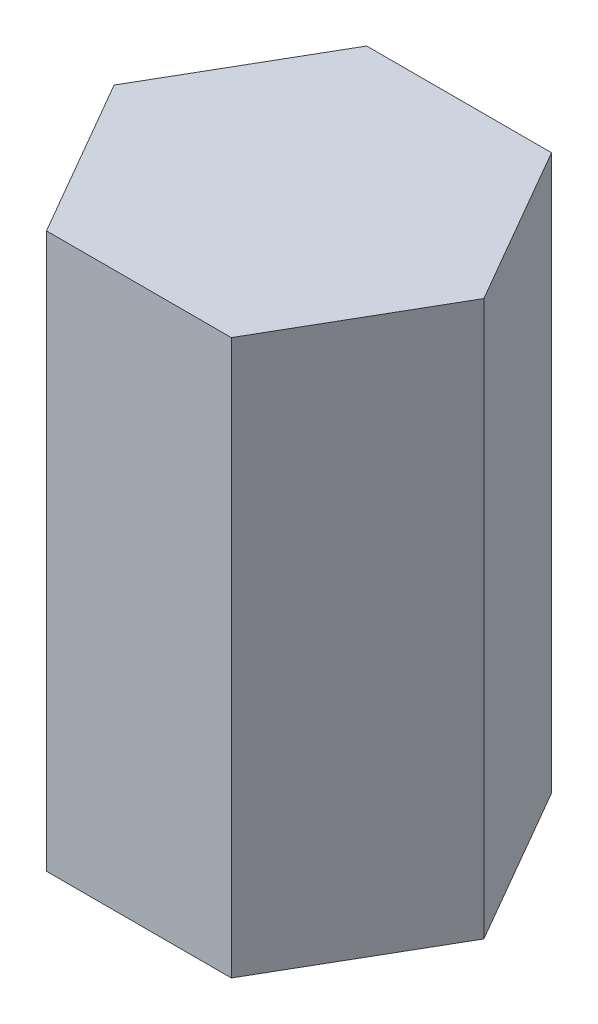
ISO-10303-21;
HEADER;
FILE_DESCRIPTION(('STEP AP214'),'2;1');
FILE_NAME('part.step','',(''),(''),'','','');
FILE_SCHEMA(('AUTOMOTIVE_DESIGN { 1 0 10303 214 1 1 1 1 }'));
ENDSEC;
DATA;
#1=APPLICATION_CONTEXT('core data for automotive mechanical design processes');
#2=APPLICATION_PROTOCOL_DEFINITION('international standard','automotive_design',2000,#1);
#3=PRODUCT_CONTEXT('',#1,'mechanical');
#4=PRODUCT('Part','Part','',(#3));
#5=PRODUCT_RELATED_PRODUCT_CATEGORY('part','',(#4));
#6=PRODUCT_DEFINITION_FORMATION('','',#4);
#7=PRODUCT_DEFINITION_CONTEXT('part definition',#1,'design');
#8=PRODUCT_DEFINITION('design','',#6,#7);
#9=PRODUCT_DEFINITION_SHAPE('','',#8);
#10=(LENGTH_UNIT() NAMED_UNIT(*) SI_UNIT(.MILLI.,.METRE.));
#11=(NAMED_UNIT(*) PLANE_ANGLE_UNIT() SI_UNIT($,.RADIAN.));
#12=(NAMED_UNIT(*) SI_UNIT($,.STERADIAN.) SOLID_ANGLE_UNIT());
#13=UNCERTAINTY_MEASURE_WITH_UNIT(LENGTH_MEASURE(1.E-05),#10,'distance_accuracy_value','');
#14=(GEOMETRIC_REPRESENTATION_CONTEXT(3) GLOBAL_UNCERTAINTY_ASSIGNED_CONTEXT((#13)) GLOBAL_UNIT_ASSIGNED_CONTEXT((#10,
#11,#12)) REPRESENTATION_CONTEXT('',''));
#15=CARTESIAN_POINT('',(0.,0.,0.));
#16=DIRECTION('',(0.,0.,1.));
#17=DIRECTION('',(1.,0.,0.));
#18=AXIS2_PLACEMENT_3D('',#15,#16,#17);
#19=CARTESIAN_POINT('',(20.0000000000004,120.,34.6410161513773));
#20=DIRECTION('',(-0.866025403784441,0.,-0.499999999999995));
#21=DIRECTION('',(-0.499999999999995,0.,0.866025403784441));
#22=AXIS2_PLACEMENT_3D('',#19,#20,#21);
#23=PLANE('',#22);
#24=DIRECTION('',(0.499999999999995,0.,-0.866025403784441));
#25=VECTOR('',#24,1.);
#26=CARTESIAN_POINT('',(20.0000000000004,0.,34.6410161513773));
#27=LINE('',#26,#25);
#28=CARTESIAN_POINT('',(20.0000000000004,0.,34.6410161513773));
#29=VERTEX_POINT('',#28);
#30=CARTESIAN_POINT('',(40.,0.,0.));
#31=VERTEX_POINT('',#30);
#32=EDGE_CURVE('E123',#29,#31,#27,.T.);
#33=ORIENTED_EDGE('',*,*,#32,.T.);
#34=DIRECTION('',(0.,-1.,0.));
#35=VECTOR('',#34,1.);
#36=CARTESIAN_POINT('',(40.,120.,0.));
#37=LINE('',#36,#35);
#38=CARTESIAN_POINT('',(40.,120.,0.));
#39=VERTEX_POINT('',#38);
#40=EDGE_CURVE('E11',#39,#31,#37,.T.);
#41=ORIENTED_EDGE('',*,*,#40,.F.);
#42=DIRECTION('',(0.499999999999995,0.,-0.866025403784441));
#43=VECTOR('',#42,1.);
#44=CARTESIAN_POINT('',(20.0000000000004,120.,34.6410161513773));
#45=LINE('',#44,#43);
#46=CARTESIAN_POINT('',(20.0000000000004,120.,34.6410161513773));
#47=VERTEX_POINT('',#46);
#48=EDGE_CURVE('E134',#47,#39,#45,.T.);
#49=ORIENTED_EDGE('',*,*,#48,.F.);
#50=DIRECTION('',(0.,-1.,0.));
#51=VECTOR('',#50,1.);
#52=CARTESIAN_POINT('',(20.0000000000004,120.,34.6410161513773));
#53=LINE('',#52,#51);
#54=EDGE_CURVE('E119',#47,#29,#53,.T.);
#55=ORIENTED_EDGE('',*,*,#54,.T.);
#56=EDGE_LOOP('',(#33,#41,#49,#55));
#57=FACE_BOUND('',#56,.T.);
#58=ADVANCED_FACE('F39',(#57),#23,.F.);
#59=CARTESIAN_POINT('',(40.,120.,0.));
#60=DIRECTION('',(-0.866025403784438,0.,0.500000000000001));
#61=DIRECTION('',(0.500000000000001,0.,0.866025403784438));
#62=AXIS2_PLACEMENT_3D('',#59,#60,#61);
#63=PLANE('',#62);
#64=DIRECTION('',(-0.500000000000001,0.,-0.866025403784438));
#65=VECTOR('',#64,1.);
#66=CARTESIAN_POINT('',(40.,0.,0.));
#67=LINE('',#66,#65);
#68=CARTESIAN_POINT('',(19.9999999999999,0.,-34.6410161513776));
#69=VERTEX_POINT('',#68);
#70=EDGE_CURVE('E126',#31,#69,#67,.T.);
#71=ORIENTED_EDGE('',*,*,#70,.T.);
#72=DIRECTION('',(0.,-1.,0.));
#73=VECTOR('',#72,1.);
#74=CARTESIAN_POINT('',(19.9999999999999,120.,-34.6410161513776));
#75=LINE('',#74,#73);
#76=CARTESIAN_POINT('',(19.9999999999999,120.,-34.6410161513776));
#77=VERTEX_POINT('',#76);
#78=EDGE_CURVE('E47',#77,#69,#75,.T.);
#79=ORIENTED_EDGE('',*,*,#78,.F.);
#80=DIRECTION('',(-0.500000000000001,0.,-0.866025403784438));
#81=VECTOR('',#80,1.);
#82=CARTESIAN_POINT('',(40.,120.,0.));
#83=LINE('',#82,#81);
#84=EDGE_CURVE('E92',#39,#77,#83,.T.);
#85=ORIENTED_EDGE('',*,*,#84,.F.);
#86=ORIENTED_EDGE('',*,*,#40,.T.);
#87=EDGE_LOOP('',(#71,#79,#85,#86));
#88=FACE_BOUND('',#87,.T.);
#89=ADVANCED_FACE('F158',(#88),#63,.F.);
#90=CARTESIAN_POINT('',(19.9999999999999,120.,-34.6410161513776));
#91=DIRECTION('',(0.,0.,1.));
#92=DIRECTION('',(1.,0.,0.));
#93=AXIS2_PLACEMENT_3D('',#90,#91,#92);
#94=PLANE('',#93);
#95=DIRECTION('',(-1.,0.,0.));
#96=VECTOR('',#95,1.);
#97=CARTESIAN_POINT('',(19.9999999999999,0.,-34.6410161513776));
#98=LINE('',#97,#96);
#99=CARTESIAN_POINT('',(-20.0000000000002,0.,-34.6410161513775));
#100=VERTEX_POINT('',#99);
#101=EDGE_CURVE('E129',#69,#100,#98,.T.);
#102=ORIENTED_EDGE('',*,*,#101,.T.);
#103=DIRECTION('',(0.,-1.,0.));
#104=VECTOR('',#103,1.);
#105=CARTESIAN_POINT('',(-20.0000000000002,120.,-34.6410161513775));
#106=LINE('',#105,#104);
#107=CARTESIAN_POINT('',(-20.0000000000002,120.,-34.6410161513775));
#108=VERTEX_POINT('',#107);
#109=EDGE_CURVE('E114',#108,#100,#106,.T.);
#110=ORIENTED_EDGE('',*,*,#109,.F.);
#111=DIRECTION('',(-1.,0.,0.));
#112=VECTOR('',#111,1.);
#113=CARTESIAN_POINT('',(19.9999999999999,120.,-34.6410161513776));
#114=LINE('',#113,#112);
#115=EDGE_CURVE('E105',#77,#108,#114,.T.);
#116=ORIENTED_EDGE('',*,*,#115,.F.);
#117=ORIENTED_EDGE('',*,*,#78,.T.);
#118=EDGE_LOOP('',(#102,#110,#116,#117));
#119=FACE_BOUND('',#118,.T.);
#120=ADVANCED_FACE('F140',(#119),#94,.F.);
#121=CARTESIAN_POINT('',(-20.0000000000002,120.,-34.6410161513775));
#122=DIRECTION('',(0.866025403784442,0.,0.499999999999995));
#123=DIRECTION('',(0.499999999999995,0.,-0.866025403784442));
#124=AXIS2_PLACEMENT_3D('',#121,#122,#123);
#125=PLANE('',#124);
#126=DIRECTION('',(-0.499999999999995,0.,0.866025403784442));
#127=VECTOR('',#126,1.);
#128=CARTESIAN_POINT('',(-20.0000000000002,0.,-34.6410161513775));
#129=LINE('',#128,#127);
#130=CARTESIAN_POINT('',(-40.,0.,2.79318507107451E-13));
#131=VERTEX_POINT('',#130);
#132=EDGE_CURVE('E113',#100,#131,#129,.T.);
#133=ORIENTED_EDGE('',*,*,#132,.T.);
#134=DIRECTION('',(0.,-1.,0.));
#135=VECTOR('',#134,1.);
#136=CARTESIAN_POINT('',(-40.,120.,2.79318507107451E-13));
#137=LINE('',#136,#135);
#138=CARTESIAN_POINT('',(-40.,120.,2.79318507107451E-13));
#139=VERTEX_POINT('',#138);
#140=EDGE_CURVE('E110',#139,#131,#137,.T.);
#141=ORIENTED_EDGE('',*,*,#140,.F.);
#142=DIRECTION('',(-0.499999999999995,0.,0.866025403784442));
#143=VECTOR('',#142,1.);
#144=CARTESIAN_POINT('',(-20.0000000000002,120.,-34.6410161513775));
#145=LINE('',#144,#143);
#146=EDGE_CURVE('E99',#108,#139,#145,.T.);
#147=ORIENTED_EDGE('',*,*,#146,.F.);
#148=ORIENTED_EDGE('',*,*,#109,.T.);
#149=EDGE_LOOP('',(#133,#141,#147,#148));
#150=FACE_BOUND('',#149,.T.);
#151=ADVANCED_FACE('F111',(#150),#125,.F.);
#152=CARTESIAN_POINT('',(-40.,120.,2.79318507107451E-13));
#153=DIRECTION('',(0.866025403784435,0.,-0.500000000000007));
#154=DIRECTION('',(-0.500000000000007,0.,-0.866025403784435));
#155=AXIS2_PLACEMENT_3D('',#152,#153,#154);
#156=PLANE('',#155);
#157=DIRECTION('',(0.500000000000007,0.,0.866025403784434));
#158=VECTOR('',#157,1.);
#159=CARTESIAN_POINT('',(-40.,0.,2.79318507107451E-13));
#160=LINE('',#159,#158);
#161=CARTESIAN_POINT('',(-19.9999999999997,0.,34.6410161513777));
#162=VERTEX_POINT('',#161);
#163=EDGE_CURVE('E78',#131,#162,#160,.T.);
#164=ORIENTED_EDGE('',*,*,#163,.T.);
#165=DIRECTION('',(0.,-1.,0.));
#166=VECTOR('',#165,1.);
#167=CARTESIAN_POINT('',(-19.9999999999997,120.,34.6410161513777));
#168=LINE('',#167,#166);
#169=CARTESIAN_POINT('',(-19.9999999999997,120.,34.6410161513777));
#170=VERTEX_POINT('',#169);
#171=EDGE_CURVE('E115',#170,#162,#168,.T.);
#172=ORIENTED_EDGE('',*,*,#171,.F.);
#173=DIRECTION('',(0.500000000000007,0.,0.866025403784434));
#174=VECTOR('',#173,1.);
#175=CARTESIAN_POINT('',(-40.,120.,2.79318507107451E-13));
#176=LINE('',#175,#174);
#177=EDGE_CURVE('E103',#139,#170,#176,.T.);
#178=ORIENTED_EDGE('',*,*,#177,.F.);
#179=ORIENTED_EDGE('',*,*,#140,.T.);
#180=EDGE_LOOP('',(#164,#172,#178,#179));
#181=FACE_BOUND('',#180,.T.);
#182=ADVANCED_FACE('F117',(#181),#156,.F.);
#183=CARTESIAN_POINT('',(-19.9999999999997,120.,34.6410161513777));
#184=DIRECTION('',(0.,0.,-1.));
#185=DIRECTION('',(-1.,0.,0.));
#186=AXIS2_PLACEMENT_3D('',#183,#184,#185);
#187=PLANE('',#186);
#188=DIRECTION('',(1.,0.,0.));
#189=VECTOR('',#188,1.);
#190=CARTESIAN_POINT('',(-19.9999999999997,0.,34.6410161513777));
#191=LINE('',#190,#189);
#192=EDGE_CURVE('E84',#162,#29,#191,.T.);
#193=ORIENTED_EDGE('',*,*,#192,.T.);
#194=ORIENTED_EDGE('',*,*,#54,.F.);
#195=DIRECTION('',(1.,0.,0.));
#196=VECTOR('',#195,1.);
#197=CARTESIAN_POINT('',(-19.9999999999997,120.,34.6410161513777));
#198=LINE('',#197,#196);
#199=EDGE_CURVE('E55',#170,#47,#198,.T.);
#200=ORIENTED_EDGE('',*,*,#199,.F.);
#201=ORIENTED_EDGE('',*,*,#171,.T.);
#202=EDGE_LOOP('',(#193,#194,#200,#201));
#203=FACE_BOUND('',#202,.T.);
#204=ADVANCED_FACE('F147',(#203),#187,.F.);
#205=CARTESIAN_POINT('',(0.,120.,0.));
#206=DIRECTION('',(0.,1.,0.));
#207=DIRECTION('',(0.,0.,1.));
#208=AXIS2_PLACEMENT_3D('',#205,#206,#207);
#209=PLANE('',#208);
#210=ORIENTED_EDGE('',*,*,#48,.T.);
#211=ORIENTED_EDGE('',*,*,#84,.T.);
#212=ORIENTED_EDGE('',*,*,#115,.T.);
#213=ORIENTED_EDGE('',*,*,#146,.T.);
#214=ORIENTED_EDGE('',*,*,#177,.T.);
#215=ORIENTED_EDGE('',*,*,#199,.T.);
#216=EDGE_LOOP('',(#210,#211,#212,#213,#214,#215));
#217=FACE_BOUND('',#216,.T.);
#218=ADVANCED_FACE('F101',(#217),#209,.T.);
#219=CARTESIAN_POINT('',(0.,0.,0.));
#220=DIRECTION('',(0.,1.,0.));
#221=DIRECTION('',(0.,0.,1.));
#222=AXIS2_PLACEMENT_3D('',#219,#220,#221);
#223=PLANE('',#222);
#224=CARTESIAN_POINT('',(0.,0.,0.));
#225=DIRECTION('',(0.,1.,0.));
#226=DIRECTION('',(0.,0.,1.));
#227=AXIS2_PLACEMENT_3D('',#224,#225,#226);
#228=CIRCLE('',#227,4.);
#229=CARTESIAN_POINT('',(0.,0.,4.));
#230=VERTEX_POINT('',#229);
#231=EDGE_CURVE('E221',#230,#230,#228,.T.);
#232=ORIENTED_EDGE('',*,*,#231,.T.);
#233=EDGE_LOOP('',(#232));
#234=FACE_BOUND('',#233,.T.);
#235=ORIENTED_EDGE('',*,*,#32,.F.);
#236=ORIENTED_EDGE('',*,*,#192,.F.);
#237=ORIENTED_EDGE('',*,*,#163,.F.);
#238=ORIENTED_EDGE('',*,*,#132,.F.);
#239=ORIENTED_EDGE('',*,*,#101,.F.);
#240=ORIENTED_EDGE('',*,*,#70,.F.);
#241=EDGE_LOOP('',(#235,#236,#237,#238,#239,#240));
#242=FACE_BOUND('',#241,.T.);
#243=ADVANCED_FACE('F143',(#234,#242),#223,.F.);
#244=CARTESIAN_POINT('',(0.,14.,0.));
#245=DIRECTION('',(0.,-1.,0.));
#246=DIRECTION('',(0.,0.,-1.));
#247=AXIS2_PLACEMENT_3D('',#244,#245,#246);
#248=CYLINDRICAL_SURFACE('',#247,4.);
#249=CARTESIAN_POINT('',(0.,14.,0.));
#250=DIRECTION('',(0.,1.,0.));
#251=DIRECTION('',(0.,0.,1.));
#252=AXIS2_PLACEMENT_3D('',#249,#250,#251);
#253=CIRCLE('',#252,4.);
#254=CARTESIAN_POINT('',(0.,14.,4.));
#255=VERTEX_POINT('',#254);
#256=EDGE_CURVE('E127',#255,#255,#253,.T.);
#257=ORIENTED_EDGE('',*,*,#256,.T.);
#258=EDGE_LOOP('',(#257));
#259=FACE_BOUND('',#258,.T.);
#260=ORIENTED_EDGE('',*,*,#231,.F.);
#261=EDGE_LOOP('',(#260));
#262=FACE_BOUND('',#261,.T.);
#263=ADVANCED_FACE('F197',(#259,#262),#248,.F.);
#264=CARTESIAN_POINT('',(0.,14.,0.));
#265=DIRECTION('',(0.,1.,0.));
#266=DIRECTION('',(0.,0.,1.));
#267=AXIS2_PLACEMENT_3D('',#264,#265,#266);
#268=PLANE('',#267);
#269=ORIENTED_EDGE('',*,*,#256,.F.);
#270=EDGE_LOOP('',(#269));
#271=FACE_BOUND('',#270,.T.);
#272=ADVANCED_FACE('F206',(#271),#268,.F.);
#273=CLOSED_SHELL('',(#58,#89,#120,#151,#182,#204,#218,#243,#263,#272));
#274=MANIFOLD_SOLID_BREP('B2',#273);
#275=ADVANCED_BREP_SHAPE_REPRESENTATION('',(#18,#274),#14);
#276=SHAPE_DEFINITION_REPRESENTATION(#9,#275);
ENDSEC;
END-ISO-10303-21;
